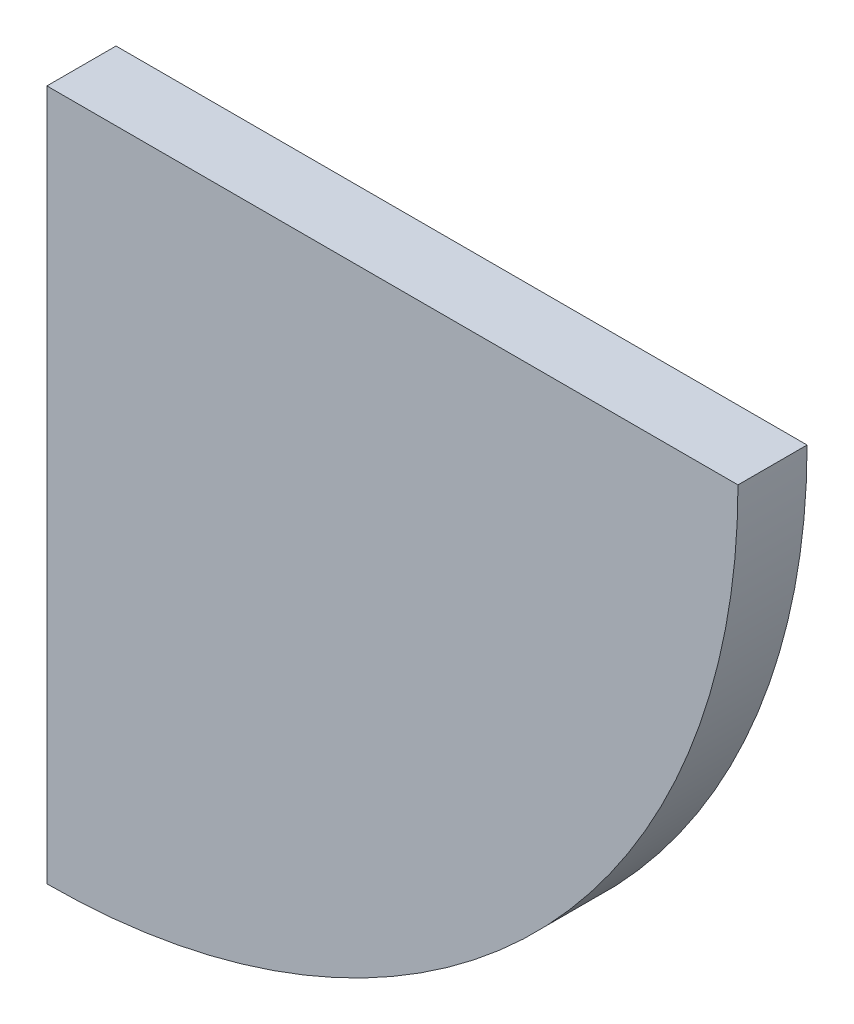
ISO-10303-21;
HEADER;
FILE_DESCRIPTION(('STEP AP214'),'2;1');
FILE_NAME('part.step','',(''),(''),'','','');
FILE_SCHEMA(('AUTOMOTIVE_DESIGN { 1 0 10303 214 1 1 1 1 }'));
ENDSEC;
DATA;
#1=APPLICATION_CONTEXT('core data for automotive mechanical design processes');
#2=APPLICATION_PROTOCOL_DEFINITION('international standard','automotive_design',2000,#1);
#3=PRODUCT_CONTEXT('',#1,'mechanical');
#4=PRODUCT('Part','Part','',(#3));
#5=PRODUCT_RELATED_PRODUCT_CATEGORY('part','',(#4));
#6=PRODUCT_DEFINITION_FORMATION('','',#4);
#7=PRODUCT_DEFINITION_CONTEXT('part definition',#1,'design');
#8=PRODUCT_DEFINITION('design','',#6,#7);
#9=PRODUCT_DEFINITION_SHAPE('','',#8);
#10=(LENGTH_UNIT() NAMED_UNIT(*) SI_UNIT(.MILLI.,.METRE.));
#11=(NAMED_UNIT(*) PLANE_ANGLE_UNIT() SI_UNIT($,.RADIAN.));
#12=(NAMED_UNIT(*) SI_UNIT($,.STERADIAN.) SOLID_ANGLE_UNIT());
#13=UNCERTAINTY_MEASURE_WITH_UNIT(LENGTH_MEASURE(1.E-05),#10,'distance_accuracy_value','');
#14=(GEOMETRIC_REPRESENTATION_CONTEXT(3) GLOBAL_UNCERTAINTY_ASSIGNED_CONTEXT((#13)) GLOBAL_UNIT_ASSIGNED_CONTEXT((#10,
#11,#12)) REPRESENTATION_CONTEXT('',''));
#15=CARTESIAN_POINT('',(0.,0.,0.));
#16=DIRECTION('',(0.,0.,1.));
#17=DIRECTION('',(1.,0.,0.));
#18=AXIS2_PLACEMENT_3D('',#15,#16,#17);
#19=CARTESIAN_POINT('',(0.,0.,0.));
#20=DIRECTION('',(0.,0.,1.));
#21=DIRECTION('',(1.,0.,0.));
#22=AXIS2_PLACEMENT_3D('',#19,#20,#21);
#23=CYLINDRICAL_SURFACE('',#22,200.);
#24=DIRECTION('',(0.,0.,1.));
#25=VECTOR('',#24,1.);
#26=CARTESIAN_POINT('',(0.,-200.,0.));
#27=LINE('',#26,#25);
#28=CARTESIAN_POINT('',(0.,-200.,0.));
#29=VERTEX_POINT('',#28);
#30=CARTESIAN_POINT('',(0.,-200.,20.));
#31=VERTEX_POINT('',#30);
#32=EDGE_CURVE('E11',#29,#31,#27,.T.);
#33=ORIENTED_EDGE('',*,*,#32,.F.);
#34=CARTESIAN_POINT('',(0.,0.,0.));
#35=DIRECTION('',(0.,0.,1.));
#36=DIRECTION('',(-1.,0.,0.));
#37=AXIS2_PLACEMENT_3D('',#34,#35,#36);
#38=CIRCLE('',#37,200.);
#39=CARTESIAN_POINT('',(200.,0.,0.));
#40=VERTEX_POINT('',#39);
#41=EDGE_CURVE('E81',#29,#40,#38,.T.);
#42=ORIENTED_EDGE('',*,*,#41,.T.);
#43=DIRECTION('',(0.,0.,1.));
#44=VECTOR('',#43,1.);
#45=CARTESIAN_POINT('',(200.,0.,0.));
#46=LINE('',#45,#44);
#47=CARTESIAN_POINT('',(200.,0.,20.));
#48=VERTEX_POINT('',#47);
#49=EDGE_CURVE('E49',#40,#48,#46,.T.);
#50=ORIENTED_EDGE('',*,*,#49,.T.);
#51=CARTESIAN_POINT('',(0.,0.,20.));
#52=DIRECTION('',(0.,0.,1.));
#53=DIRECTION('',(1.,0.,0.));
#54=AXIS2_PLACEMENT_3D('',#51,#52,#53);
#55=CIRCLE('',#54,200.);
#56=EDGE_CURVE('E91',#31,#48,#55,.T.);
#57=ORIENTED_EDGE('',*,*,#56,.F.);
#58=EDGE_LOOP('',(#33,#42,#50,#57));
#59=FACE_BOUND('',#58,.T.);
#60=ADVANCED_FACE('F39',(#59),#23,.T.);
#61=CARTESIAN_POINT('',(0.,0.,0.));
#62=DIRECTION('',(0.,-1.,0.));
#63=DIRECTION('',(-1.,0.,0.));
#64=AXIS2_PLACEMENT_3D('',#61,#62,#63);
#65=PLANE('',#64);
#66=ORIENTED_EDGE('',*,*,#49,.F.);
#67=DIRECTION('',(-1.,0.,0.));
#68=VECTOR('',#67,1.);
#69=CARTESIAN_POINT('',(0.,0.,0.));
#70=LINE('',#69,#68);
#71=CARTESIAN_POINT('',(0.,0.,0.));
#72=VERTEX_POINT('',#71);
#73=EDGE_CURVE('E72',#40,#72,#70,.T.);
#74=ORIENTED_EDGE('',*,*,#73,.T.);
#75=DIRECTION('',(0.,0.,1.));
#76=VECTOR('',#75,1.);
#77=CARTESIAN_POINT('',(0.,0.,0.));
#78=LINE('',#77,#76);
#79=CARTESIAN_POINT('',(0.,0.,20.));
#80=VERTEX_POINT('',#79);
#81=EDGE_CURVE('E43',#72,#80,#78,.T.);
#82=ORIENTED_EDGE('',*,*,#81,.T.);
#83=DIRECTION('',(-1.,0.,0.));
#84=VECTOR('',#83,1.);
#85=CARTESIAN_POINT('',(0.,0.,20.));
#86=LINE('',#85,#84);
#87=EDGE_CURVE('E74',#48,#80,#86,.T.);
#88=ORIENTED_EDGE('',*,*,#87,.F.);
#89=EDGE_LOOP('',(#66,#74,#82,#88));
#90=FACE_BOUND('',#89,.T.);
#91=ADVANCED_FACE('F71',(#90),#65,.F.);
#92=CARTESIAN_POINT('',(0.,-200.,0.));
#93=DIRECTION('',(1.,0.,0.));
#94=DIRECTION('',(0.,-1.,0.));
#95=AXIS2_PLACEMENT_3D('',#92,#93,#94);
#96=PLANE('',#95);
#97=DIRECTION('',(0.,-1.,0.));
#98=VECTOR('',#97,1.);
#99=CARTESIAN_POINT('',(0.,-200.,0.));
#100=LINE('',#99,#98);
#101=EDGE_CURVE('E82',#72,#29,#100,.T.);
#102=ORIENTED_EDGE('',*,*,#101,.T.);
#103=ORIENTED_EDGE('',*,*,#32,.T.);
#104=DIRECTION('',(0.,1.,0.));
#105=VECTOR('',#104,1.);
#106=CARTESIAN_POINT('',(0.,0.,20.));
#107=LINE('',#106,#105);
#108=EDGE_CURVE('E85',#80,#31,#107,.F.);
#109=ORIENTED_EDGE('',*,*,#108,.F.);
#110=ORIENTED_EDGE('',*,*,#81,.F.);
#111=EDGE_LOOP('',(#102,#103,#109,#110));
#112=FACE_BOUND('',#111,.T.);
#113=ADVANCED_FACE('F41',(#112),#96,.F.);
#114=CARTESIAN_POINT('',(0.,0.,20.));
#115=DIRECTION('',(0.,0.,-1.));
#116=DIRECTION('',(-1.,0.,0.));
#117=AXIS2_PLACEMENT_3D('',#114,#115,#116);
#118=PLANE('',#117);
#119=ORIENTED_EDGE('',*,*,#87,.T.);
#120=ORIENTED_EDGE('',*,*,#108,.T.);
#121=ORIENTED_EDGE('',*,*,#56,.T.);
#122=EDGE_LOOP('',(#119,#120,#121));
#123=FACE_BOUND('',#122,.T.);
#124=ADVANCED_FACE('F95',(#123),#118,.F.);
#125=CARTESIAN_POINT('',(0.,0.,0.));
#126=DIRECTION('',(0.,0.,-1.));
#127=DIRECTION('',(-1.,0.,0.));
#128=AXIS2_PLACEMENT_3D('',#125,#126,#127);
#129=PLANE('',#128);
#130=ORIENTED_EDGE('',*,*,#73,.F.);
#131=ORIENTED_EDGE('',*,*,#41,.F.);
#132=ORIENTED_EDGE('',*,*,#101,.F.);
#133=EDGE_LOOP('',(#130,#131,#132));
#134=FACE_BOUND('',#133,.T.);
#135=ADVANCED_FACE('F80',(#134),#129,.T.);
#136=CLOSED_SHELL('',(#60,#91,#113,#124,#135));
#137=MANIFOLD_SOLID_BREP('B2',#136);
#138=ADVANCED_BREP_SHAPE_REPRESENTATION('',(#18,#137),#14);
#139=SHAPE_DEFINITION_REPRESENTATION(#9,#138);
ENDSEC;
END-ISO-10303-21;
